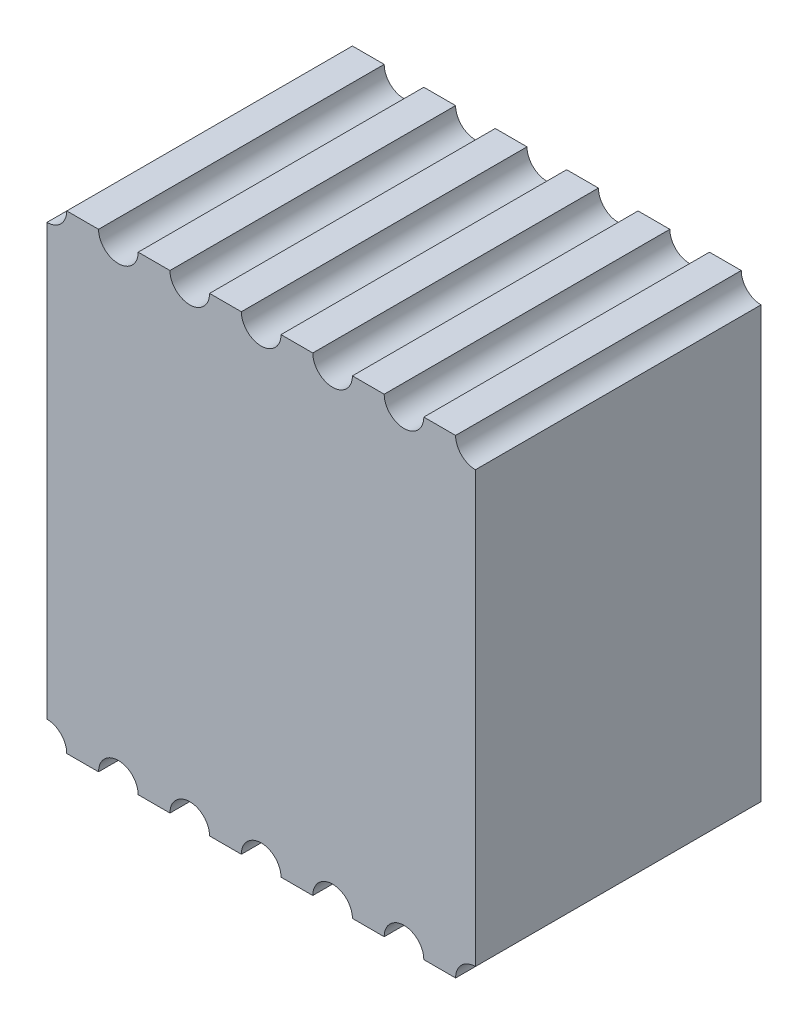
ISO-10303-21;
HEADER;
FILE_DESCRIPTION(('STEP AP214'),'2;1');
FILE_NAME('part.step','',(''),(''),'','','');
FILE_SCHEMA(('AUTOMOTIVE_DESIGN { 1 0 10303 214 1 1 1 1 }'));
ENDSEC;
DATA;
#1=APPLICATION_CONTEXT('core data for automotive mechanical design processes');
#2=APPLICATION_PROTOCOL_DEFINITION('international standard','automotive_design',2000,#1);
#3=PRODUCT_CONTEXT('',#1,'mechanical');
#4=PRODUCT('Part','Part','',(#3));
#5=PRODUCT_RELATED_PRODUCT_CATEGORY('part','',(#4));
#6=PRODUCT_DEFINITION_FORMATION('','',#4);
#7=PRODUCT_DEFINITION_CONTEXT('part definition',#1,'design');
#8=PRODUCT_DEFINITION('design','',#6,#7);
#9=PRODUCT_DEFINITION_SHAPE('','',#8);
#10=(LENGTH_UNIT() NAMED_UNIT(*) SI_UNIT(.MILLI.,.METRE.));
#11=(NAMED_UNIT(*) PLANE_ANGLE_UNIT() SI_UNIT($,.RADIAN.));
#12=(NAMED_UNIT(*) SI_UNIT($,.STERADIAN.) SOLID_ANGLE_UNIT());
#13=UNCERTAINTY_MEASURE_WITH_UNIT(LENGTH_MEASURE(1.E-05),#10,'distance_accuracy_value','');
#14=(GEOMETRIC_REPRESENTATION_CONTEXT(3) GLOBAL_UNCERTAINTY_ASSIGNED_CONTEXT((#13)) GLOBAL_UNIT_ASSIGNED_CONTEXT((#10,
#11,#12)) REPRESENTATION_CONTEXT('',''));
#15=CARTESIAN_POINT('',(0.,0.,0.));
#16=DIRECTION('',(0.,0.,1.));
#17=DIRECTION('',(1.,0.,0.));
#18=AXIS2_PLACEMENT_3D('',#15,#16,#17);
#19=CARTESIAN_POINT('',(9.99999999999997,13.1600000000002,8.));
#20=DIRECTION('',(0.,0.,-1.));
#21=DIRECTION('',(-1.,0.,0.));
#22=AXIS2_PLACEMENT_3D('',#19,#20,#21);
#23=CYLINDRICAL_SURFACE('',#22,0.555);
#24=CARTESIAN_POINT('',(9.99999999999997,13.1600000000002,0.));
#25=DIRECTION('',(0.,0.,-1.));
#26=DIRECTION('',(1.,0.,0.));
#27=AXIS2_PLACEMENT_3D('',#24,#25,#26);
#28=CIRCLE('',#27,0.555);
#29=CARTESIAN_POINT('',(10.555,13.1600000000002,0.));
#30=VERTEX_POINT('',#29);
#31=CARTESIAN_POINT('',(9.44499999999997,13.1600000000002,0.));
#32=VERTEX_POINT('',#31);
#33=EDGE_CURVE('E266',#30,#32,#28,.T.);
#34=ORIENTED_EDGE('',*,*,#33,.T.);
#35=DIRECTION('',(0.,0.,-1.));
#36=VECTOR('',#35,1.);
#37=CARTESIAN_POINT('',(9.44499999999997,13.1600000000002,8.));
#38=LINE('',#37,#36);
#39=CARTESIAN_POINT('',(9.44499999999997,13.1600000000002,8.));
#40=VERTEX_POINT('',#39);
#41=EDGE_CURVE('E11',#40,#32,#38,.T.);
#42=ORIENTED_EDGE('',*,*,#41,.F.);
#43=CARTESIAN_POINT('',(9.99999999999997,13.1600000000002,8.));
#44=DIRECTION('',(0.,0.,-1.));
#45=DIRECTION('',(1.,0.,0.));
#46=AXIS2_PLACEMENT_3D('',#43,#44,#45);
#47=CIRCLE('',#46,0.555);
#48=CARTESIAN_POINT('',(10.555,13.1600000000002,8.));
#49=VERTEX_POINT('',#48);
#50=EDGE_CURVE('E348',#49,#40,#47,.T.);
#51=ORIENTED_EDGE('',*,*,#50,.F.);
#52=DIRECTION('',(0.,0.,-1.));
#53=VECTOR('',#52,1.);
#54=CARTESIAN_POINT('',(10.555,13.1600000000002,8.));
#55=LINE('',#54,#53);
#56=EDGE_CURVE('E262',#49,#30,#55,.T.);
#57=ORIENTED_EDGE('',*,*,#56,.T.);
#58=EDGE_LOOP('',(#34,#42,#51,#57));
#59=FACE_BOUND('',#58,.T.);
#60=ADVANCED_FACE('F45',(#59),#23,.F.);
#61=CARTESIAN_POINT('',(9.44499999999997,13.1600000000002,8.));
#62=DIRECTION('',(0.,-1.,0.));
#63=DIRECTION('',(0.,0.,-1.));
#64=AXIS2_PLACEMENT_3D('',#61,#62,#63);
#65=PLANE('',#64);
#66=DIRECTION('',(-1.,0.,0.));
#67=VECTOR('',#66,1.);
#68=CARTESIAN_POINT('',(9.44499999999997,13.1600000000002,0.));
#69=LINE('',#68,#67);
#70=CARTESIAN_POINT('',(8.55499999999997,13.1600000000002,0.));
#71=VERTEX_POINT('',#70);
#72=EDGE_CURVE('E270',#32,#71,#69,.T.);
#73=ORIENTED_EDGE('',*,*,#72,.T.);
#74=DIRECTION('',(0.,0.,-1.));
#75=VECTOR('',#74,1.);
#76=CARTESIAN_POINT('',(8.55499999999997,13.1600000000002,8.));
#77=LINE('',#76,#75);
#78=CARTESIAN_POINT('',(8.55499999999997,13.1600000000002,8.));
#79=VERTEX_POINT('',#78);
#80=EDGE_CURVE('E54',#79,#71,#77,.T.);
#81=ORIENTED_EDGE('',*,*,#80,.F.);
#82=DIRECTION('',(-1.,0.,0.));
#83=VECTOR('',#82,1.);
#84=CARTESIAN_POINT('',(9.44499999999997,13.1600000000002,8.));
#85=LINE('',#84,#83);
#86=EDGE_CURVE('E165',#40,#79,#85,.T.);
#87=ORIENTED_EDGE('',*,*,#86,.F.);
#88=ORIENTED_EDGE('',*,*,#41,.T.);
#89=EDGE_LOOP('',(#73,#81,#87,#88));
#90=FACE_BOUND('',#89,.T.);
#91=ADVANCED_FACE('F554',(#90),#65,.F.);
#92=CARTESIAN_POINT('',(7.99999999999997,13.1600000000002,8.));
#93=DIRECTION('',(0.,0.,-1.));
#94=DIRECTION('',(-1.,0.,0.));
#95=AXIS2_PLACEMENT_3D('',#92,#93,#94);
#96=CYLINDRICAL_SURFACE('',#95,0.555);
#97=CARTESIAN_POINT('',(7.99999999999997,13.1600000000002,0.));
#98=DIRECTION('',(0.,0.,-1.));
#99=DIRECTION('',(1.,0.,0.));
#100=AXIS2_PLACEMENT_3D('',#97,#98,#99);
#101=CIRCLE('',#100,0.555);
#102=CARTESIAN_POINT('',(7.44499999999997,13.1600000000002,0.));
#103=VERTEX_POINT('',#102);
#104=EDGE_CURVE('E273',#71,#103,#101,.T.);
#105=ORIENTED_EDGE('',*,*,#104,.T.);
#106=DIRECTION('',(0.,0.,-1.));
#107=VECTOR('',#106,1.);
#108=CARTESIAN_POINT('',(7.44499999999997,13.1600000000002,8.));
#109=LINE('',#108,#107);
#110=CARTESIAN_POINT('',(7.44499999999997,13.1600000000002,8.));
#111=VERTEX_POINT('',#110);
#112=EDGE_CURVE('E439',#111,#103,#109,.T.);
#113=ORIENTED_EDGE('',*,*,#112,.F.);
#114=CARTESIAN_POINT('',(7.99999999999997,13.1600000000002,8.));
#115=DIRECTION('',(0.,0.,-1.));
#116=DIRECTION('',(1.,0.,0.));
#117=AXIS2_PLACEMENT_3D('',#114,#115,#116);
#118=CIRCLE('',#117,0.555);
#119=EDGE_CURVE('E449',#79,#111,#118,.T.);
#120=ORIENTED_EDGE('',*,*,#119,.F.);
#121=ORIENTED_EDGE('',*,*,#80,.T.);
#122=EDGE_LOOP('',(#105,#113,#120,#121));
#123=FACE_BOUND('',#122,.T.);
#124=ADVANCED_FACE('F447',(#123),#96,.F.);
#125=CARTESIAN_POINT('',(7.44499999999997,13.1600000000002,8.));
#126=DIRECTION('',(0.,-1.,0.));
#127=DIRECTION('',(0.,0.,-1.));
#128=AXIS2_PLACEMENT_3D('',#125,#126,#127);
#129=PLANE('',#128);
#130=DIRECTION('',(-1.,0.,0.));
#131=VECTOR('',#130,1.);
#132=CARTESIAN_POINT('',(7.44499999999997,13.1600000000002,0.));
#133=LINE('',#132,#131);
#134=CARTESIAN_POINT('',(6.55499999999997,13.1600000000002,0.));
#135=VERTEX_POINT('',#134);
#136=EDGE_CURVE('E276',#103,#135,#133,.T.);
#137=ORIENTED_EDGE('',*,*,#136,.T.);
#138=DIRECTION('',(0.,0.,-1.));
#139=VECTOR('',#138,1.);
#140=CARTESIAN_POINT('',(6.55499999999997,13.1600000000002,8.));
#141=LINE('',#140,#139);
#142=CARTESIAN_POINT('',(6.55499999999997,13.1600000000002,8.));
#143=VERTEX_POINT('',#142);
#144=EDGE_CURVE('E435',#143,#135,#141,.T.);
#145=ORIENTED_EDGE('',*,*,#144,.F.);
#146=DIRECTION('',(-1.,0.,0.));
#147=VECTOR('',#146,1.);
#148=CARTESIAN_POINT('',(7.44499999999997,13.1600000000002,8.));
#149=LINE('',#148,#147);
#150=EDGE_CURVE('E468',#111,#143,#149,.T.);
#151=ORIENTED_EDGE('',*,*,#150,.F.);
#152=ORIENTED_EDGE('',*,*,#112,.T.);
#153=EDGE_LOOP('',(#137,#145,#151,#152));
#154=FACE_BOUND('',#153,.T.);
#155=ADVANCED_FACE('F458',(#154),#129,.F.);
#156=CARTESIAN_POINT('',(5.99999999999999,13.1600000000002,8.));
#157=DIRECTION('',(0.,0.,-1.));
#158=DIRECTION('',(-1.,0.,0.));
#159=AXIS2_PLACEMENT_3D('',#156,#157,#158);
#160=CYLINDRICAL_SURFACE('',#159,0.554999999999976);
#161=CARTESIAN_POINT('',(5.99999999999999,13.1600000000002,0.));
#162=DIRECTION('',(0.,0.,-1.));
#163=DIRECTION('',(-1.,0.,0.));
#164=AXIS2_PLACEMENT_3D('',#161,#162,#163);
#165=CIRCLE('',#164,0.554999999999976);
#166=CARTESIAN_POINT('',(5.44500000000002,13.1600000000002,0.));
#167=VERTEX_POINT('',#166);
#168=EDGE_CURVE('E279',#135,#167,#165,.T.);
#169=ORIENTED_EDGE('',*,*,#168,.T.);
#170=DIRECTION('',(0.,0.,-1.));
#171=VECTOR('',#170,1.);
#172=CARTESIAN_POINT('',(5.44500000000002,13.1600000000002,8.));
#173=LINE('',#172,#171);
#174=CARTESIAN_POINT('',(5.44500000000002,13.1600000000002,8.));
#175=VERTEX_POINT('',#174);
#176=EDGE_CURVE('E431',#175,#167,#173,.T.);
#177=ORIENTED_EDGE('',*,*,#176,.F.);
#178=CARTESIAN_POINT('',(5.99999999999999,13.1600000000002,8.));
#179=DIRECTION('',(0.,0.,-1.));
#180=DIRECTION('',(-1.,0.,0.));
#181=AXIS2_PLACEMENT_3D('',#178,#179,#180);
#182=CIRCLE('',#181,0.554999999999976);
#183=EDGE_CURVE('E464',#143,#175,#182,.T.);
#184=ORIENTED_EDGE('',*,*,#183,.F.);
#185=ORIENTED_EDGE('',*,*,#144,.T.);
#186=EDGE_LOOP('',(#169,#177,#184,#185));
#187=FACE_BOUND('',#186,.T.);
#188=ADVANCED_FACE('F462',(#187),#160,.F.);
#189=CARTESIAN_POINT('',(5.44500000000002,13.1600000000002,8.));
#190=DIRECTION('',(0.,-1.,0.));
#191=DIRECTION('',(0.,0.,-1.));
#192=AXIS2_PLACEMENT_3D('',#189,#190,#191);
#193=PLANE('',#192);
#194=DIRECTION('',(-1.,0.,0.));
#195=VECTOR('',#194,1.);
#196=CARTESIAN_POINT('',(5.44500000000002,13.1600000000002,0.));
#197=LINE('',#196,#195);
#198=CARTESIAN_POINT('',(4.55499999999997,13.1600000000002,0.));
#199=VERTEX_POINT('',#198);
#200=EDGE_CURVE('E282',#167,#199,#197,.T.);
#201=ORIENTED_EDGE('',*,*,#200,.T.);
#202=DIRECTION('',(0.,0.,-1.));
#203=VECTOR('',#202,1.);
#204=CARTESIAN_POINT('',(4.55499999999997,13.1600000000002,8.));
#205=LINE('',#204,#203);
#206=CARTESIAN_POINT('',(4.55499999999997,13.1600000000002,8.));
#207=VERTEX_POINT('',#206);
#208=EDGE_CURVE('E427',#207,#199,#205,.T.);
#209=ORIENTED_EDGE('',*,*,#208,.F.);
#210=DIRECTION('',(-1.,0.,0.));
#211=VECTOR('',#210,1.);
#212=CARTESIAN_POINT('',(5.44500000000002,13.1600000000002,8.));
#213=LINE('',#212,#211);
#214=EDGE_CURVE('E467',#175,#207,#213,.T.);
#215=ORIENTED_EDGE('',*,*,#214,.F.);
#216=ORIENTED_EDGE('',*,*,#176,.T.);
#217=EDGE_LOOP('',(#201,#209,#215,#216));
#218=FACE_BOUND('',#217,.T.);
#219=ADVANCED_FACE('F567',(#218),#193,.F.);
#220=CARTESIAN_POINT('',(3.99999999999997,13.1600000000002,8.));
#221=DIRECTION('',(0.,0.,-1.));
#222=DIRECTION('',(-1.,0.,0.));
#223=AXIS2_PLACEMENT_3D('',#220,#221,#222);
#224=CYLINDRICAL_SURFACE('',#223,0.555);
#225=CARTESIAN_POINT('',(3.99999999999997,13.1600000000002,0.));
#226=DIRECTION('',(0.,0.,-1.));
#227=DIRECTION('',(-1.,0.,0.));
#228=AXIS2_PLACEMENT_3D('',#225,#226,#227);
#229=CIRCLE('',#228,0.555);
#230=CARTESIAN_POINT('',(3.44499999999997,13.1600000000001,0.));
#231=VERTEX_POINT('',#230);
#232=EDGE_CURVE('E285',#199,#231,#229,.T.);
#233=ORIENTED_EDGE('',*,*,#232,.T.);
#234=DIRECTION('',(0.,0.,-1.));
#235=VECTOR('',#234,1.);
#236=CARTESIAN_POINT('',(3.44499999999997,13.1600000000001,8.));
#237=LINE('',#236,#235);
#238=CARTESIAN_POINT('',(3.44499999999997,13.1600000000001,8.));
#239=VERTEX_POINT('',#238);
#240=EDGE_CURVE('E423',#239,#231,#237,.T.);
#241=ORIENTED_EDGE('',*,*,#240,.F.);
#242=CARTESIAN_POINT('',(3.99999999999997,13.1600000000002,8.));
#243=DIRECTION('',(0.,0.,-1.));
#244=DIRECTION('',(-1.,0.,0.));
#245=AXIS2_PLACEMENT_3D('',#242,#243,#244);
#246=CIRCLE('',#245,0.555);
#247=EDGE_CURVE('E472',#207,#239,#246,.T.);
#248=ORIENTED_EDGE('',*,*,#247,.F.);
#249=ORIENTED_EDGE('',*,*,#208,.T.);
#250=EDGE_LOOP('',(#233,#241,#248,#249));
#251=FACE_BOUND('',#250,.T.);
#252=ADVANCED_FACE('F570',(#251),#224,.F.);
#253=CARTESIAN_POINT('',(3.44499999999997,13.1600000000001,8.));
#254=DIRECTION('',(0.,-1.,0.));
#255=DIRECTION('',(0.,0.,-1.));
#256=AXIS2_PLACEMENT_3D('',#253,#254,#255);
#257=PLANE('',#256);
#258=DIRECTION('',(-1.,0.,0.));
#259=VECTOR('',#258,1.);
#260=CARTESIAN_POINT('',(3.44499999999997,13.1600000000001,0.));
#261=LINE('',#260,#259);
#262=CARTESIAN_POINT('',(2.55499999999997,13.1600000000001,0.));
#263=VERTEX_POINT('',#262);
#264=EDGE_CURVE('E288',#231,#263,#261,.T.);
#265=ORIENTED_EDGE('',*,*,#264,.T.);
#266=DIRECTION('',(0.,0.,-1.));
#267=VECTOR('',#266,1.);
#268=CARTESIAN_POINT('',(2.55499999999997,13.1600000000001,8.));
#269=LINE('',#268,#267);
#270=CARTESIAN_POINT('',(2.55499999999997,13.1600000000001,8.));
#271=VERTEX_POINT('',#270);
#272=EDGE_CURVE('E419',#271,#263,#269,.T.);
#273=ORIENTED_EDGE('',*,*,#272,.F.);
#274=DIRECTION('',(-1.,0.,0.));
#275=VECTOR('',#274,1.);
#276=CARTESIAN_POINT('',(3.44499999999997,13.1600000000001,8.));
#277=LINE('',#276,#275);
#278=EDGE_CURVE('E479',#239,#271,#277,.T.);
#279=ORIENTED_EDGE('',*,*,#278,.F.);
#280=ORIENTED_EDGE('',*,*,#240,.T.);
#281=EDGE_LOOP('',(#265,#273,#279,#280));
#282=FACE_BOUND('',#281,.T.);
#283=ADVANCED_FACE('F574',(#282),#257,.F.);
#284=CARTESIAN_POINT('',(1.99999999999997,13.1600000000001,8.));
#285=DIRECTION('',(0.,0.,-1.));
#286=DIRECTION('',(-1.,0.,0.));
#287=AXIS2_PLACEMENT_3D('',#284,#285,#286);
#288=CYLINDRICAL_SURFACE('',#287,0.555);
#289=CARTESIAN_POINT('',(1.99999999999997,13.1600000000001,0.));
#290=DIRECTION('',(0.,0.,-1.));
#291=DIRECTION('',(1.,0.,0.));
#292=AXIS2_PLACEMENT_3D('',#289,#290,#291);
#293=CIRCLE('',#292,0.555);
#294=CARTESIAN_POINT('',(1.44499999999997,13.1600000000001,0.));
#295=VERTEX_POINT('',#294);
#296=EDGE_CURVE('E291',#263,#295,#293,.T.);
#297=ORIENTED_EDGE('',*,*,#296,.T.);
#298=DIRECTION('',(0.,0.,-1.));
#299=VECTOR('',#298,1.);
#300=CARTESIAN_POINT('',(1.44499999999997,13.1600000000001,8.));
#301=LINE('',#300,#299);
#302=CARTESIAN_POINT('',(1.44499999999997,13.1600000000001,8.));
#303=VERTEX_POINT('',#302);
#304=EDGE_CURVE('E415',#303,#295,#301,.T.);
#305=ORIENTED_EDGE('',*,*,#304,.F.);
#306=CARTESIAN_POINT('',(1.99999999999997,13.1600000000001,8.));
#307=DIRECTION('',(0.,0.,-1.));
#308=DIRECTION('',(1.,0.,0.));
#309=AXIS2_PLACEMENT_3D('',#306,#307,#308);
#310=CIRCLE('',#309,0.555);
#311=EDGE_CURVE('E482',#271,#303,#310,.T.);
#312=ORIENTED_EDGE('',*,*,#311,.F.);
#313=ORIENTED_EDGE('',*,*,#272,.T.);
#314=EDGE_LOOP('',(#297,#305,#312,#313));
#315=FACE_BOUND('',#314,.T.);
#316=ADVANCED_FACE('F578',(#315),#288,.F.);
#317=CARTESIAN_POINT('',(1.44499999999997,13.1600000000001,8.));
#318=DIRECTION('',(0.,-1.,0.));
#319=DIRECTION('',(0.,0.,-1.));
#320=AXIS2_PLACEMENT_3D('',#317,#318,#319);
#321=PLANE('',#320);
#322=DIRECTION('',(-1.,0.,0.));
#323=VECTOR('',#322,1.);
#324=CARTESIAN_POINT('',(1.44499999999997,13.1600000000001,0.));
#325=LINE('',#324,#323);
#326=CARTESIAN_POINT('',(0.554999999999979,13.1600000000001,0.));
#327=VERTEX_POINT('',#326);
#328=EDGE_CURVE('E294',#295,#327,#325,.T.);
#329=ORIENTED_EDGE('',*,*,#328,.T.);
#330=DIRECTION('',(0.,0.,-1.));
#331=VECTOR('',#330,1.);
#332=CARTESIAN_POINT('',(0.554999999999979,13.1600000000001,8.));
#333=LINE('',#332,#331);
#334=CARTESIAN_POINT('',(0.554999999999979,13.1600000000001,8.));
#335=VERTEX_POINT('',#334);
#336=EDGE_CURVE('E411',#335,#327,#333,.T.);
#337=ORIENTED_EDGE('',*,*,#336,.F.);
#338=DIRECTION('',(-1.,0.,0.));
#339=VECTOR('',#338,1.);
#340=CARTESIAN_POINT('',(1.44499999999997,13.1600000000001,8.));
#341=LINE('',#340,#339);
#342=EDGE_CURVE('E485',#303,#335,#341,.T.);
#343=ORIENTED_EDGE('',*,*,#342,.F.);
#344=ORIENTED_EDGE('',*,*,#304,.T.);
#345=EDGE_LOOP('',(#329,#337,#343,#344));
#346=FACE_BOUND('',#345,.T.);
#347=ADVANCED_FACE('F582',(#346),#321,.F.);
#348=CARTESIAN_POINT('',(0.,13.1600000000001,8.));
#349=DIRECTION('',(0.,0.,-1.));
#350=DIRECTION('',(-1.,0.,0.));
#351=AXIS2_PLACEMENT_3D('',#348,#349,#350);
#352=CYLINDRICAL_SURFACE('',#351,0.555000000000007);
#353=CARTESIAN_POINT('',(0.,13.1600000000001,0.));
#354=DIRECTION('',(0.,0.,-1.));
#355=DIRECTION('',(-1.,0.,0.));
#356=AXIS2_PLACEMENT_3D('',#353,#354,#355);
#357=CIRCLE('',#356,0.555000000000007);
#358=CARTESIAN_POINT('',(0.,12.6050000000001,0.));
#359=VERTEX_POINT('',#358);
#360=EDGE_CURVE('E297',#327,#359,#357,.T.);
#361=ORIENTED_EDGE('',*,*,#360,.T.);
#362=DIRECTION('',(0.,0.,-1.));
#363=VECTOR('',#362,1.);
#364=CARTESIAN_POINT('',(0.,12.6050000000001,8.));
#365=LINE('',#364,#363);
#366=CARTESIAN_POINT('',(0.,12.6050000000001,8.));
#367=VERTEX_POINT('',#366);
#368=EDGE_CURVE('E407',#367,#359,#365,.T.);
#369=ORIENTED_EDGE('',*,*,#368,.F.);
#370=CARTESIAN_POINT('',(0.,13.1600000000001,8.));
#371=DIRECTION('',(0.,0.,-1.));
#372=DIRECTION('',(-1.,0.,0.));
#373=AXIS2_PLACEMENT_3D('',#370,#371,#372);
#374=CIRCLE('',#373,0.555000000000007);
#375=EDGE_CURVE('E488',#335,#367,#374,.T.);
#376=ORIENTED_EDGE('',*,*,#375,.F.);
#377=ORIENTED_EDGE('',*,*,#336,.T.);
#378=EDGE_LOOP('',(#361,#369,#376,#377));
#379=FACE_BOUND('',#378,.T.);
#380=ADVANCED_FACE('F586',(#379),#352,.F.);
#381=CARTESIAN_POINT('',(0.,12.6050000000001,8.));
#382=DIRECTION('',(1.,0.,0.));
#383=DIRECTION('',(0.,1.,0.));
#384=AXIS2_PLACEMENT_3D('',#381,#382,#383);
#385=PLANE('',#384);
#386=DIRECTION('',(0.,-1.,0.));
#387=VECTOR('',#386,1.);
#388=CARTESIAN_POINT('',(0.,12.6050000000001,0.));
#389=LINE('',#388,#387);
#390=CARTESIAN_POINT('',(0.,0.555,0.));
#391=VERTEX_POINT('',#390);
#392=EDGE_CURVE('E300',#359,#391,#389,.T.);
#393=ORIENTED_EDGE('',*,*,#392,.T.);
#394=DIRECTION('',(0.,0.,-1.));
#395=VECTOR('',#394,1.);
#396=CARTESIAN_POINT('',(0.,0.555,8.));
#397=LINE('',#396,#395);
#398=CARTESIAN_POINT('',(0.,0.555,8.));
#399=VERTEX_POINT('',#398);
#400=EDGE_CURVE('E403',#399,#391,#397,.T.);
#401=ORIENTED_EDGE('',*,*,#400,.F.);
#402=DIRECTION('',(0.,-1.,0.));
#403=VECTOR('',#402,1.);
#404=CARTESIAN_POINT('',(0.,12.6050000000001,8.));
#405=LINE('',#404,#403);
#406=EDGE_CURVE('E491',#367,#399,#405,.T.);
#407=ORIENTED_EDGE('',*,*,#406,.F.);
#408=ORIENTED_EDGE('',*,*,#368,.T.);
#409=EDGE_LOOP('',(#393,#401,#407,#408));
#410=FACE_BOUND('',#409,.T.);
#411=ADVANCED_FACE('F590',(#410),#385,.F.);
#412=CARTESIAN_POINT('',(0.,0.,8.));
#413=DIRECTION('',(0.,0.,-1.));
#414=DIRECTION('',(-1.,0.,0.));
#415=AXIS2_PLACEMENT_3D('',#412,#413,#414);
#416=CYLINDRICAL_SURFACE('',#415,0.555);
#417=CARTESIAN_POINT('',(0.,0.,0.));
#418=DIRECTION('',(0.,0.,-1.));
#419=DIRECTION('',(1.,0.,0.));
#420=AXIS2_PLACEMENT_3D('',#417,#418,#419);
#421=CIRCLE('',#420,0.555);
#422=CARTESIAN_POINT('',(0.555,0.,0.));
#423=VERTEX_POINT('',#422);
#424=EDGE_CURVE('E303',#391,#423,#421,.T.);
#425=ORIENTED_EDGE('',*,*,#424,.T.);
#426=DIRECTION('',(0.,0.,-1.));
#427=VECTOR('',#426,1.);
#428=CARTESIAN_POINT('',(0.555,0.,8.));
#429=LINE('',#428,#427);
#430=CARTESIAN_POINT('',(0.555,0.,8.));
#431=VERTEX_POINT('',#430);
#432=EDGE_CURVE('E399',#431,#423,#429,.T.);
#433=ORIENTED_EDGE('',*,*,#432,.F.);
#434=CARTESIAN_POINT('',(0.,0.,8.));
#435=DIRECTION('',(0.,0.,-1.));
#436=DIRECTION('',(1.,0.,0.));
#437=AXIS2_PLACEMENT_3D('',#434,#435,#436);
#438=CIRCLE('',#437,0.555);
#439=EDGE_CURVE('E494',#399,#431,#438,.T.);
#440=ORIENTED_EDGE('',*,*,#439,.F.);
#441=ORIENTED_EDGE('',*,*,#400,.T.);
#442=EDGE_LOOP('',(#425,#433,#440,#441));
#443=FACE_BOUND('',#442,.T.);
#444=ADVANCED_FACE('F594',(#443),#416,.F.);
#445=CARTESIAN_POINT('',(1.445,0.,8.));
#446=DIRECTION('',(0.,1.,0.));
#447=DIRECTION('',(0.,0.,1.));
#448=AXIS2_PLACEMENT_3D('',#445,#446,#447);
#449=PLANE('',#448);
#450=DIRECTION('',(1.,0.,0.));
#451=VECTOR('',#450,1.);
#452=CARTESIAN_POINT('',(1.445,0.,0.));
#453=LINE('',#452,#451);
#454=CARTESIAN_POINT('',(1.445,0.,0.));
#455=VERTEX_POINT('',#454);
#456=EDGE_CURVE('E306',#423,#455,#453,.T.);
#457=ORIENTED_EDGE('',*,*,#456,.T.);
#458=DIRECTION('',(0.,0.,-1.));
#459=VECTOR('',#458,1.);
#460=CARTESIAN_POINT('',(1.445,0.,8.));
#461=LINE('',#460,#459);
#462=CARTESIAN_POINT('',(1.445,0.,8.));
#463=VERTEX_POINT('',#462);
#464=EDGE_CURVE('E395',#463,#455,#461,.T.);
#465=ORIENTED_EDGE('',*,*,#464,.F.);
#466=DIRECTION('',(1.,0.,0.));
#467=VECTOR('',#466,1.);
#468=CARTESIAN_POINT('',(1.445,0.,8.));
#469=LINE('',#468,#467);
#470=EDGE_CURVE('E497',#431,#463,#469,.T.);
#471=ORIENTED_EDGE('',*,*,#470,.F.);
#472=ORIENTED_EDGE('',*,*,#432,.T.);
#473=EDGE_LOOP('',(#457,#465,#471,#472));
#474=FACE_BOUND('',#473,.T.);
#475=ADVANCED_FACE('F598',(#474),#449,.F.);
#476=CARTESIAN_POINT('',(2.,0.,8.));
#477=DIRECTION('',(0.,0.,-1.));
#478=DIRECTION('',(-1.,0.,0.));
#479=AXIS2_PLACEMENT_3D('',#476,#477,#478);
#480=CYLINDRICAL_SURFACE('',#479,0.555);
#481=CARTESIAN_POINT('',(2.,0.,0.));
#482=DIRECTION('',(0.,0.,-1.));
#483=DIRECTION('',(-1.,0.,0.));
#484=AXIS2_PLACEMENT_3D('',#481,#482,#483);
#485=CIRCLE('',#484,0.555);
#486=CARTESIAN_POINT('',(2.555,0.,0.));
#487=VERTEX_POINT('',#486);
#488=EDGE_CURVE('E309',#455,#487,#485,.T.);
#489=ORIENTED_EDGE('',*,*,#488,.T.);
#490=DIRECTION('',(0.,0.,-1.));
#491=VECTOR('',#490,1.);
#492=CARTESIAN_POINT('',(2.555,0.,8.));
#493=LINE('',#492,#491);
#494=CARTESIAN_POINT('',(2.555,0.,8.));
#495=VERTEX_POINT('',#494);
#496=EDGE_CURVE('E391',#495,#487,#493,.T.);
#497=ORIENTED_EDGE('',*,*,#496,.F.);
#498=CARTESIAN_POINT('',(2.,0.,8.));
#499=DIRECTION('',(0.,0.,-1.));
#500=DIRECTION('',(-1.,0.,0.));
#501=AXIS2_PLACEMENT_3D('',#498,#499,#500);
#502=CIRCLE('',#501,0.555);
#503=EDGE_CURVE('E500',#463,#495,#502,.T.);
#504=ORIENTED_EDGE('',*,*,#503,.F.);
#505=ORIENTED_EDGE('',*,*,#464,.T.);
#506=EDGE_LOOP('',(#489,#497,#504,#505));
#507=FACE_BOUND('',#506,.T.);
#508=ADVANCED_FACE('F602',(#507),#480,.F.);
#509=CARTESIAN_POINT('',(3.445,0.,8.));
#510=DIRECTION('',(0.,1.,0.));
#511=DIRECTION('',(0.,0.,1.));
#512=AXIS2_PLACEMENT_3D('',#509,#510,#511);
#513=PLANE('',#512);
#514=DIRECTION('',(1.,0.,0.));
#515=VECTOR('',#514,1.);
#516=CARTESIAN_POINT('',(3.445,0.,0.));
#517=LINE('',#516,#515);
#518=CARTESIAN_POINT('',(3.445,0.,0.));
#519=VERTEX_POINT('',#518);
#520=EDGE_CURVE('E312',#487,#519,#517,.T.);
#521=ORIENTED_EDGE('',*,*,#520,.T.);
#522=DIRECTION('',(0.,0.,-1.));
#523=VECTOR('',#522,1.);
#524=CARTESIAN_POINT('',(3.445,0.,8.));
#525=LINE('',#524,#523);
#526=CARTESIAN_POINT('',(3.445,0.,8.));
#527=VERTEX_POINT('',#526);
#528=EDGE_CURVE('E387',#527,#519,#525,.T.);
#529=ORIENTED_EDGE('',*,*,#528,.F.);
#530=DIRECTION('',(1.,0.,0.));
#531=VECTOR('',#530,1.);
#532=CARTESIAN_POINT('',(3.445,0.,8.));
#533=LINE('',#532,#531);
#534=EDGE_CURVE('E503',#495,#527,#533,.T.);
#535=ORIENTED_EDGE('',*,*,#534,.F.);
#536=ORIENTED_EDGE('',*,*,#496,.T.);
#537=EDGE_LOOP('',(#521,#529,#535,#536));
#538=FACE_BOUND('',#537,.T.);
#539=ADVANCED_FACE('F606',(#538),#513,.F.);
#540=CARTESIAN_POINT('',(4.,0.,8.));
#541=DIRECTION('',(0.,0.,-1.));
#542=DIRECTION('',(-1.,0.,0.));
#543=AXIS2_PLACEMENT_3D('',#540,#541,#542);
#544=CYLINDRICAL_SURFACE('',#543,0.555);
#545=CARTESIAN_POINT('',(4.,0.,0.));
#546=DIRECTION('',(0.,0.,-1.));
#547=DIRECTION('',(1.,0.,0.));
#548=AXIS2_PLACEMENT_3D('',#545,#546,#547);
#549=CIRCLE('',#548,0.555);
#550=CARTESIAN_POINT('',(4.555,0.,0.));
#551=VERTEX_POINT('',#550);
#552=EDGE_CURVE('E315',#519,#551,#549,.T.);
#553=ORIENTED_EDGE('',*,*,#552,.T.);
#554=DIRECTION('',(0.,0.,-1.));
#555=VECTOR('',#554,1.);
#556=CARTESIAN_POINT('',(4.555,0.,8.));
#557=LINE('',#556,#555);
#558=CARTESIAN_POINT('',(4.555,0.,8.));
#559=VERTEX_POINT('',#558);
#560=EDGE_CURVE('E383',#559,#551,#557,.T.);
#561=ORIENTED_EDGE('',*,*,#560,.F.);
#562=CARTESIAN_POINT('',(4.,0.,8.));
#563=DIRECTION('',(0.,0.,-1.));
#564=DIRECTION('',(1.,0.,0.));
#565=AXIS2_PLACEMENT_3D('',#562,#563,#564);
#566=CIRCLE('',#565,0.555);
#567=EDGE_CURVE('E506',#527,#559,#566,.T.);
#568=ORIENTED_EDGE('',*,*,#567,.F.);
#569=ORIENTED_EDGE('',*,*,#528,.T.);
#570=EDGE_LOOP('',(#553,#561,#568,#569));
#571=FACE_BOUND('',#570,.T.);
#572=ADVANCED_FACE('F610',(#571),#544,.F.);
#573=CARTESIAN_POINT('',(5.445,0.,8.));
#574=DIRECTION('',(0.,1.,0.));
#575=DIRECTION('',(0.,0.,1.));
#576=AXIS2_PLACEMENT_3D('',#573,#574,#575);
#577=PLANE('',#576);
#578=DIRECTION('',(1.,0.,0.));
#579=VECTOR('',#578,1.);
#580=CARTESIAN_POINT('',(5.445,0.,0.));
#581=LINE('',#580,#579);
#582=CARTESIAN_POINT('',(5.445,0.,0.));
#583=VERTEX_POINT('',#582);
#584=EDGE_CURVE('E318',#551,#583,#581,.T.);
#585=ORIENTED_EDGE('',*,*,#584,.T.);
#586=DIRECTION('',(0.,0.,-1.));
#587=VECTOR('',#586,1.);
#588=CARTESIAN_POINT('',(5.445,0.,8.));
#589=LINE('',#588,#587);
#590=CARTESIAN_POINT('',(5.445,0.,8.));
#591=VERTEX_POINT('',#590);
#592=EDGE_CURVE('E379',#591,#583,#589,.T.);
#593=ORIENTED_EDGE('',*,*,#592,.F.);
#594=DIRECTION('',(1.,0.,0.));
#595=VECTOR('',#594,1.);
#596=CARTESIAN_POINT('',(5.445,0.,8.));
#597=LINE('',#596,#595);
#598=EDGE_CURVE('E509',#559,#591,#597,.T.);
#599=ORIENTED_EDGE('',*,*,#598,.F.);
#600=ORIENTED_EDGE('',*,*,#560,.T.);
#601=EDGE_LOOP('',(#585,#593,#599,#600));
#602=FACE_BOUND('',#601,.T.);
#603=ADVANCED_FACE('F614',(#602),#577,.F.);
#604=CARTESIAN_POINT('',(6.,0.,8.));
#605=DIRECTION('',(0.,0.,-1.));
#606=DIRECTION('',(-1.,0.,0.));
#607=AXIS2_PLACEMENT_3D('',#604,#605,#606);
#608=CYLINDRICAL_SURFACE('',#607,0.555);
#609=CARTESIAN_POINT('',(6.,0.,0.));
#610=DIRECTION('',(0.,0.,-1.));
#611=DIRECTION('',(1.,0.,0.));
#612=AXIS2_PLACEMENT_3D('',#609,#610,#611);
#613=CIRCLE('',#612,0.555);
#614=CARTESIAN_POINT('',(6.555,0.,0.));
#615=VERTEX_POINT('',#614);
#616=EDGE_CURVE('E321',#583,#615,#613,.T.);
#617=ORIENTED_EDGE('',*,*,#616,.T.);
#618=DIRECTION('',(0.,0.,-1.));
#619=VECTOR('',#618,1.);
#620=CARTESIAN_POINT('',(6.555,0.,8.));
#621=LINE('',#620,#619);
#622=CARTESIAN_POINT('',(6.555,0.,8.));
#623=VERTEX_POINT('',#622);
#624=EDGE_CURVE('E375',#623,#615,#621,.T.);
#625=ORIENTED_EDGE('',*,*,#624,.F.);
#626=CARTESIAN_POINT('',(6.,0.,8.));
#627=DIRECTION('',(0.,0.,-1.));
#628=DIRECTION('',(1.,0.,0.));
#629=AXIS2_PLACEMENT_3D('',#626,#627,#628);
#630=CIRCLE('',#629,0.555);
#631=EDGE_CURVE('E512',#591,#623,#630,.T.);
#632=ORIENTED_EDGE('',*,*,#631,.F.);
#633=ORIENTED_EDGE('',*,*,#592,.T.);
#634=EDGE_LOOP('',(#617,#625,#632,#633));
#635=FACE_BOUND('',#634,.T.);
#636=ADVANCED_FACE('F618',(#635),#608,.F.);
#637=CARTESIAN_POINT('',(7.445,0.,8.));
#638=DIRECTION('',(0.,1.,0.));
#639=DIRECTION('',(0.,0.,1.));
#640=AXIS2_PLACEMENT_3D('',#637,#638,#639);
#641=PLANE('',#640);
#642=DIRECTION('',(1.,0.,0.));
#643=VECTOR('',#642,1.);
#644=CARTESIAN_POINT('',(7.445,0.,0.));
#645=LINE('',#644,#643);
#646=CARTESIAN_POINT('',(7.445,0.,0.));
#647=VERTEX_POINT('',#646);
#648=EDGE_CURVE('E324',#615,#647,#645,.T.);
#649=ORIENTED_EDGE('',*,*,#648,.T.);
#650=DIRECTION('',(0.,0.,-1.));
#651=VECTOR('',#650,1.);
#652=CARTESIAN_POINT('',(7.445,0.,8.));
#653=LINE('',#652,#651);
#654=CARTESIAN_POINT('',(7.445,0.,8.));
#655=VERTEX_POINT('',#654);
#656=EDGE_CURVE('E371',#655,#647,#653,.T.);
#657=ORIENTED_EDGE('',*,*,#656,.F.);
#658=DIRECTION('',(1.,0.,0.));
#659=VECTOR('',#658,1.);
#660=CARTESIAN_POINT('',(7.445,0.,8.));
#661=LINE('',#660,#659);
#662=EDGE_CURVE('E515',#623,#655,#661,.T.);
#663=ORIENTED_EDGE('',*,*,#662,.F.);
#664=ORIENTED_EDGE('',*,*,#624,.T.);
#665=EDGE_LOOP('',(#649,#657,#663,#664));
#666=FACE_BOUND('',#665,.T.);
#667=ADVANCED_FACE('F622',(#666),#641,.F.);
#668=CARTESIAN_POINT('',(8.,0.,8.));
#669=DIRECTION('',(0.,0.,-1.));
#670=DIRECTION('',(-1.,0.,0.));
#671=AXIS2_PLACEMENT_3D('',#668,#669,#670);
#672=CYLINDRICAL_SURFACE('',#671,0.555);
#673=CARTESIAN_POINT('',(8.,0.,0.));
#674=DIRECTION('',(0.,0.,-1.));
#675=DIRECTION('',(-1.,0.,0.));
#676=AXIS2_PLACEMENT_3D('',#673,#674,#675);
#677=CIRCLE('',#676,0.555);
#678=CARTESIAN_POINT('',(8.555,0.,0.));
#679=VERTEX_POINT('',#678);
#680=EDGE_CURVE('E327',#647,#679,#677,.T.);
#681=ORIENTED_EDGE('',*,*,#680,.T.);
#682=DIRECTION('',(0.,0.,-1.));
#683=VECTOR('',#682,1.);
#684=CARTESIAN_POINT('',(8.555,0.,8.));
#685=LINE('',#684,#683);
#686=CARTESIAN_POINT('',(8.555,0.,8.));
#687=VERTEX_POINT('',#686);
#688=EDGE_CURVE('E367',#687,#679,#685,.T.);
#689=ORIENTED_EDGE('',*,*,#688,.F.);
#690=CARTESIAN_POINT('',(8.,0.,8.));
#691=DIRECTION('',(0.,0.,-1.));
#692=DIRECTION('',(-1.,0.,0.));
#693=AXIS2_PLACEMENT_3D('',#690,#691,#692);
#694=CIRCLE('',#693,0.555);
#695=EDGE_CURVE('E518',#655,#687,#694,.T.);
#696=ORIENTED_EDGE('',*,*,#695,.F.);
#697=ORIENTED_EDGE('',*,*,#656,.T.);
#698=EDGE_LOOP('',(#681,#689,#696,#697));
#699=FACE_BOUND('',#698,.T.);
#700=ADVANCED_FACE('F626',(#699),#672,.F.);
#701=CARTESIAN_POINT('',(9.44499999999999,0.,8.));
#702=DIRECTION('',(0.,1.,0.));
#703=DIRECTION('',(0.,0.,1.));
#704=AXIS2_PLACEMENT_3D('',#701,#702,#703);
#705=PLANE('',#704);
#706=DIRECTION('',(1.,0.,0.));
#707=VECTOR('',#706,1.);
#708=CARTESIAN_POINT('',(9.44499999999999,0.,0.));
#709=LINE('',#708,#707);
#710=CARTESIAN_POINT('',(9.44499999999999,0.,0.));
#711=VERTEX_POINT('',#710);
#712=EDGE_CURVE('E330',#679,#711,#709,.T.);
#713=ORIENTED_EDGE('',*,*,#712,.T.);
#714=DIRECTION('',(0.,0.,-1.));
#715=VECTOR('',#714,1.);
#716=CARTESIAN_POINT('',(9.44499999999999,0.,8.));
#717=LINE('',#716,#715);
#718=CARTESIAN_POINT('',(9.44499999999999,0.,8.));
#719=VERTEX_POINT('',#718);
#720=EDGE_CURVE('E363',#719,#711,#717,.T.);
#721=ORIENTED_EDGE('',*,*,#720,.F.);
#722=DIRECTION('',(1.,0.,0.));
#723=VECTOR('',#722,1.);
#724=CARTESIAN_POINT('',(9.44499999999999,0.,8.));
#725=LINE('',#724,#723);
#726=EDGE_CURVE('E521',#687,#719,#725,.T.);
#727=ORIENTED_EDGE('',*,*,#726,.F.);
#728=ORIENTED_EDGE('',*,*,#688,.T.);
#729=EDGE_LOOP('',(#713,#721,#727,#728));
#730=FACE_BOUND('',#729,.T.);
#731=ADVANCED_FACE('F630',(#730),#705,.F.);
#732=CARTESIAN_POINT('',(9.99999999999999,-1.04083408558608E-13,8.));
#733=DIRECTION('',(0.,0.,-1.));
#734=DIRECTION('',(-1.,0.,0.));
#735=AXIS2_PLACEMENT_3D('',#732,#733,#734);
#736=CYLINDRICAL_SURFACE('',#735,0.555);
#737=CARTESIAN_POINT('',(9.99999999999999,-1.04083408558608E-13,0.));
#738=DIRECTION('',(0.,0.,-1.));
#739=DIRECTION('',(-1.,0.,0.));
#740=AXIS2_PLACEMENT_3D('',#737,#738,#739);
#741=CIRCLE('',#740,0.555);
#742=CARTESIAN_POINT('',(10.555,-1.17961196366423E-13,0.));
#743=VERTEX_POINT('',#742);
#744=EDGE_CURVE('E333',#711,#743,#741,.T.);
#745=ORIENTED_EDGE('',*,*,#744,.T.);
#746=DIRECTION('',(0.,0.,-1.));
#747=VECTOR('',#746,1.);
#748=CARTESIAN_POINT('',(10.555,-1.17961196366423E-13,8.));
#749=LINE('',#748,#747);
#750=CARTESIAN_POINT('',(10.555,-1.17961196366423E-13,8.));
#751=VERTEX_POINT('',#750);
#752=EDGE_CURVE('E359',#751,#743,#749,.T.);
#753=ORIENTED_EDGE('',*,*,#752,.F.);
#754=CARTESIAN_POINT('',(9.99999999999999,-1.04083408558608E-13,8.));
#755=DIRECTION('',(0.,0.,-1.));
#756=DIRECTION('',(-1.,0.,0.));
#757=AXIS2_PLACEMENT_3D('',#754,#755,#756);
#758=CIRCLE('',#757,0.555);
#759=EDGE_CURVE('E524',#719,#751,#758,.T.);
#760=ORIENTED_EDGE('',*,*,#759,.F.);
#761=ORIENTED_EDGE('',*,*,#720,.T.);
#762=EDGE_LOOP('',(#745,#753,#760,#761));
#763=FACE_BOUND('',#762,.T.);
#764=ADVANCED_FACE('F634',(#763),#736,.F.);
#765=CARTESIAN_POINT('',(11.445,-1.17961196366423E-13,8.));
#766=DIRECTION('',(0.,1.,0.));
#767=DIRECTION('',(0.,0.,1.));
#768=AXIS2_PLACEMENT_3D('',#765,#766,#767);
#769=PLANE('',#768);
#770=DIRECTION('',(1.,0.,0.));
#771=VECTOR('',#770,1.);
#772=CARTESIAN_POINT('',(11.445,-1.17961196366423E-13,0.));
#773=LINE('',#772,#771);
#774=CARTESIAN_POINT('',(11.445,-1.17961196366423E-13,0.));
#775=VERTEX_POINT('',#774);
#776=EDGE_CURVE('E336',#743,#775,#773,.T.);
#777=ORIENTED_EDGE('',*,*,#776,.T.);
#778=DIRECTION('',(0.,0.,-1.));
#779=VECTOR('',#778,1.);
#780=CARTESIAN_POINT('',(11.445,-1.17961196366423E-13,8.));
#781=LINE('',#780,#779);
#782=CARTESIAN_POINT('',(11.445,-1.17961196366423E-13,8.));
#783=VERTEX_POINT('',#782);
#784=EDGE_CURVE('E355',#783,#775,#781,.T.);
#785=ORIENTED_EDGE('',*,*,#784,.F.);
#786=DIRECTION('',(1.,0.,0.));
#787=VECTOR('',#786,1.);
#788=CARTESIAN_POINT('',(11.445,-1.17961196366423E-13,8.));
#789=LINE('',#788,#787);
#790=EDGE_CURVE('E527',#751,#783,#789,.T.);
#791=ORIENTED_EDGE('',*,*,#790,.F.);
#792=ORIENTED_EDGE('',*,*,#752,.T.);
#793=EDGE_LOOP('',(#777,#785,#791,#792));
#794=FACE_BOUND('',#793,.T.);
#795=ADVANCED_FACE('F535',(#794),#769,.F.);
#796=CARTESIAN_POINT('',(12.,-1.2490009027033E-13,8.));
#797=DIRECTION('',(0.,0.,-1.));
#798=DIRECTION('',(-1.,0.,0.));
#799=AXIS2_PLACEMENT_3D('',#796,#797,#798);
#800=CYLINDRICAL_SURFACE('',#799,0.555);
#801=CARTESIAN_POINT('',(12.,-1.2490009027033E-13,0.));
#802=DIRECTION('',(0.,0.,-1.));
#803=DIRECTION('',(-1.,0.,0.));
#804=AXIS2_PLACEMENT_3D('',#801,#802,#803);
#805=CIRCLE('',#804,0.555);
#806=CARTESIAN_POINT('',(12.,0.554999999999875,0.));
#807=VERTEX_POINT('',#806);
#808=EDGE_CURVE('E339',#775,#807,#805,.T.);
#809=ORIENTED_EDGE('',*,*,#808,.T.);
#810=DIRECTION('',(0.,0.,-1.));
#811=VECTOR('',#810,1.);
#812=CARTESIAN_POINT('',(12.,0.554999999999875,8.));
#813=LINE('',#812,#811);
#814=CARTESIAN_POINT('',(12.,0.554999999999875,8.));
#815=VERTEX_POINT('',#814);
#816=EDGE_CURVE('E255',#815,#807,#813,.T.);
#817=ORIENTED_EDGE('',*,*,#816,.F.);
#818=CARTESIAN_POINT('',(12.,-1.2490009027033E-13,8.));
#819=DIRECTION('',(0.,0.,-1.));
#820=DIRECTION('',(-1.,0.,0.));
#821=AXIS2_PLACEMENT_3D('',#818,#819,#820);
#822=CIRCLE('',#821,0.555);
#823=EDGE_CURVE('E244',#783,#815,#822,.T.);
#824=ORIENTED_EDGE('',*,*,#823,.F.);
#825=ORIENTED_EDGE('',*,*,#784,.T.);
#826=EDGE_LOOP('',(#809,#817,#824,#825));
#827=FACE_BOUND('',#826,.T.);
#828=ADVANCED_FACE('F539',(#827),#800,.F.);
#829=CARTESIAN_POINT('',(12.,12.6050000000002,8.));
#830=DIRECTION('',(-1.,0.,0.));
#831=DIRECTION('',(0.,-1.,0.));
#832=AXIS2_PLACEMENT_3D('',#829,#830,#831);
#833=PLANE('',#832);
#834=DIRECTION('',(0.,1.,0.));
#835=VECTOR('',#834,1.);
#836=CARTESIAN_POINT('',(12.,12.6050000000002,0.));
#837=LINE('',#836,#835);
#838=CARTESIAN_POINT('',(12.,12.6050000000002,0.));
#839=VERTEX_POINT('',#838);
#840=EDGE_CURVE('E253',#807,#839,#837,.T.);
#841=ORIENTED_EDGE('',*,*,#840,.T.);
#842=DIRECTION('',(0.,0.,-1.));
#843=VECTOR('',#842,1.);
#844=CARTESIAN_POINT('',(12.,12.6050000000002,8.));
#845=LINE('',#844,#843);
#846=CARTESIAN_POINT('',(12.,12.6050000000002,8.));
#847=VERTEX_POINT('',#846);
#848=EDGE_CURVE('E250',#847,#839,#845,.T.);
#849=ORIENTED_EDGE('',*,*,#848,.F.);
#850=DIRECTION('',(0.,1.,0.));
#851=VECTOR('',#850,1.);
#852=CARTESIAN_POINT('',(12.,12.6050000000002,8.));
#853=LINE('',#852,#851);
#854=EDGE_CURVE('E238',#815,#847,#853,.T.);
#855=ORIENTED_EDGE('',*,*,#854,.F.);
#856=ORIENTED_EDGE('',*,*,#816,.T.);
#857=EDGE_LOOP('',(#841,#849,#855,#856));
#858=FACE_BOUND('',#857,.T.);
#859=ADVANCED_FACE('F251',(#858),#833,.F.);
#860=CARTESIAN_POINT('',(12.,13.1600000000002,8.));
#861=DIRECTION('',(0.,0.,-1.));
#862=DIRECTION('',(-1.,0.,0.));
#863=AXIS2_PLACEMENT_3D('',#860,#861,#862);
#864=CYLINDRICAL_SURFACE('',#863,0.555000000000007);
#865=CARTESIAN_POINT('',(12.,13.1600000000002,0.));
#866=DIRECTION('',(0.,0.,-1.));
#867=DIRECTION('',(1.,0.,0.));
#868=AXIS2_PLACEMENT_3D('',#865,#866,#867);
#869=CIRCLE('',#868,0.555000000000007);
#870=CARTESIAN_POINT('',(11.445,13.1600000000002,0.));
#871=VERTEX_POINT('',#870);
#872=EDGE_CURVE('E151',#839,#871,#869,.T.);
#873=ORIENTED_EDGE('',*,*,#872,.T.);
#874=DIRECTION('',(0.,0.,-1.));
#875=VECTOR('',#874,1.);
#876=CARTESIAN_POINT('',(11.445,13.1600000000002,8.));
#877=LINE('',#876,#875);
#878=CARTESIAN_POINT('',(11.445,13.1600000000002,8.));
#879=VERTEX_POINT('',#878);
#880=EDGE_CURVE('E256',#879,#871,#877,.T.);
#881=ORIENTED_EDGE('',*,*,#880,.F.);
#882=CARTESIAN_POINT('',(12.,13.1600000000002,8.));
#883=DIRECTION('',(0.,0.,-1.));
#884=DIRECTION('',(1.,0.,0.));
#885=AXIS2_PLACEMENT_3D('',#882,#883,#884);
#886=CIRCLE('',#885,0.555000000000007);
#887=EDGE_CURVE('E242',#847,#879,#886,.T.);
#888=ORIENTED_EDGE('',*,*,#887,.F.);
#889=ORIENTED_EDGE('',*,*,#848,.T.);
#890=EDGE_LOOP('',(#873,#881,#888,#889));
#891=FACE_BOUND('',#890,.T.);
#892=ADVANCED_FACE('F258',(#891),#864,.F.);
#893=CARTESIAN_POINT('',(11.445,13.1600000000002,8.));
#894=DIRECTION('',(0.,-1.,0.));
#895=DIRECTION('',(0.,0.,-1.));
#896=AXIS2_PLACEMENT_3D('',#893,#894,#895);
#897=PLANE('',#896);
#898=DIRECTION('',(-1.,0.,0.));
#899=VECTOR('',#898,1.);
#900=CARTESIAN_POINT('',(11.445,13.1600000000002,0.));
#901=LINE('',#900,#899);
#902=EDGE_CURVE('E157',#871,#30,#901,.T.);
#903=ORIENTED_EDGE('',*,*,#902,.T.);
#904=ORIENTED_EDGE('',*,*,#56,.F.);
#905=DIRECTION('',(-1.,0.,0.));
#906=VECTOR('',#905,1.);
#907=CARTESIAN_POINT('',(11.445,13.1600000000002,8.));
#908=LINE('',#907,#906);
#909=EDGE_CURVE('E62',#879,#49,#908,.T.);
#910=ORIENTED_EDGE('',*,*,#909,.F.);
#911=ORIENTED_EDGE('',*,*,#880,.T.);
#912=EDGE_LOOP('',(#903,#904,#910,#911));
#913=FACE_BOUND('',#912,.T.);
#914=ADVANCED_FACE('F543',(#913),#897,.F.);
#915=CARTESIAN_POINT('',(9.99999999999997,13.1600000000002,8.));
#916=DIRECTION('',(0.,0.,1.));
#917=DIRECTION('',(1.,0.,0.));
#918=AXIS2_PLACEMENT_3D('',#915,#916,#917);
#919=PLANE('',#918);
#920=ORIENTED_EDGE('',*,*,#50,.T.);
#921=ORIENTED_EDGE('',*,*,#86,.T.);
#922=ORIENTED_EDGE('',*,*,#119,.T.);
#923=ORIENTED_EDGE('',*,*,#150,.T.);
#924=ORIENTED_EDGE('',*,*,#183,.T.);
#925=ORIENTED_EDGE('',*,*,#214,.T.);
#926=ORIENTED_EDGE('',*,*,#247,.T.);
#927=ORIENTED_EDGE('',*,*,#278,.T.);
#928=ORIENTED_EDGE('',*,*,#311,.T.);
#929=ORIENTED_EDGE('',*,*,#342,.T.);
#930=ORIENTED_EDGE('',*,*,#375,.T.);
#931=ORIENTED_EDGE('',*,*,#406,.T.);
#932=ORIENTED_EDGE('',*,*,#439,.T.);
#933=ORIENTED_EDGE('',*,*,#470,.T.);
#934=ORIENTED_EDGE('',*,*,#503,.T.);
#935=ORIENTED_EDGE('',*,*,#534,.T.);
#936=ORIENTED_EDGE('',*,*,#567,.T.);
#937=ORIENTED_EDGE('',*,*,#598,.T.);
#938=ORIENTED_EDGE('',*,*,#631,.T.);
#939=ORIENTED_EDGE('',*,*,#662,.T.);
#940=ORIENTED_EDGE('',*,*,#695,.T.);
#941=ORIENTED_EDGE('',*,*,#726,.T.);
#942=ORIENTED_EDGE('',*,*,#759,.T.);
#943=ORIENTED_EDGE('',*,*,#790,.T.);
#944=ORIENTED_EDGE('',*,*,#823,.T.);
#945=ORIENTED_EDGE('',*,*,#854,.T.);
#946=ORIENTED_EDGE('',*,*,#887,.T.);
#947=ORIENTED_EDGE('',*,*,#909,.T.);
#948=EDGE_LOOP('',(#920,#921,#922,#923,#924,#925,#926,#927,#928,#929,#930,#931,#932,#933,#934,
#935,#936,#937,#938,#939,#940,#941,#942,#943,#944,#945,#946,#947));
#949=FACE_BOUND('',#948,.T.);
#950=ADVANCED_FACE('F240',(#949),#919,.T.);
#951=CARTESIAN_POINT('',(9.99999999999997,13.1600000000002,0.));
#952=DIRECTION('',(0.,0.,1.));
#953=DIRECTION('',(1.,0.,0.));
#954=AXIS2_PLACEMENT_3D('',#951,#952,#953);
#955=PLANE('',#954);
#956=ORIENTED_EDGE('',*,*,#33,.F.);
#957=ORIENTED_EDGE('',*,*,#902,.F.);
#958=ORIENTED_EDGE('',*,*,#872,.F.);
#959=ORIENTED_EDGE('',*,*,#840,.F.);
#960=ORIENTED_EDGE('',*,*,#808,.F.);
#961=ORIENTED_EDGE('',*,*,#776,.F.);
#962=ORIENTED_EDGE('',*,*,#744,.F.);
#963=ORIENTED_EDGE('',*,*,#712,.F.);
#964=ORIENTED_EDGE('',*,*,#680,.F.);
#965=ORIENTED_EDGE('',*,*,#648,.F.);
#966=ORIENTED_EDGE('',*,*,#616,.F.);
#967=ORIENTED_EDGE('',*,*,#584,.F.);
#968=ORIENTED_EDGE('',*,*,#552,.F.);
#969=ORIENTED_EDGE('',*,*,#520,.F.);
#970=ORIENTED_EDGE('',*,*,#488,.F.);
#971=ORIENTED_EDGE('',*,*,#456,.F.);
#972=ORIENTED_EDGE('',*,*,#424,.F.);
#973=ORIENTED_EDGE('',*,*,#392,.F.);
#974=ORIENTED_EDGE('',*,*,#360,.F.);
#975=ORIENTED_EDGE('',*,*,#328,.F.);
#976=ORIENTED_EDGE('',*,*,#296,.F.);
#977=ORIENTED_EDGE('',*,*,#264,.F.);
#978=ORIENTED_EDGE('',*,*,#232,.F.);
#979=ORIENTED_EDGE('',*,*,#200,.F.);
#980=ORIENTED_EDGE('',*,*,#168,.F.);
#981=ORIENTED_EDGE('',*,*,#136,.F.);
#982=ORIENTED_EDGE('',*,*,#104,.F.);
#983=ORIENTED_EDGE('',*,*,#72,.F.);
#984=EDGE_LOOP('',(#956,#957,#958,#959,#960,#961,#962,#963,#964,#965,#966,#967,#968,#969,#970,
#971,#972,#973,#974,#975,#976,#977,#978,#979,#980,#981,#982,#983));
#985=FACE_BOUND('',#984,.T.);
#986=ADVANCED_FACE('F453',(#985),#955,.F.);
#987=CLOSED_SHELL('',(#60,#91,#124,#155,#188,#219,#252,#283,#316,#347,#380,#411,#444,#475,#508,
#539,#572,#603,#636,#667,#700,#731,#764,#795,#828,#859,#892,#914,#950,#986));
#988=MANIFOLD_SOLID_BREP('B2',#987);
#989=ADVANCED_BREP_SHAPE_REPRESENTATION('',(#18,#988),#14);
#990=SHAPE_DEFINITION_REPRESENTATION(#9,#989);
ENDSEC;
END-ISO-10303-21;
